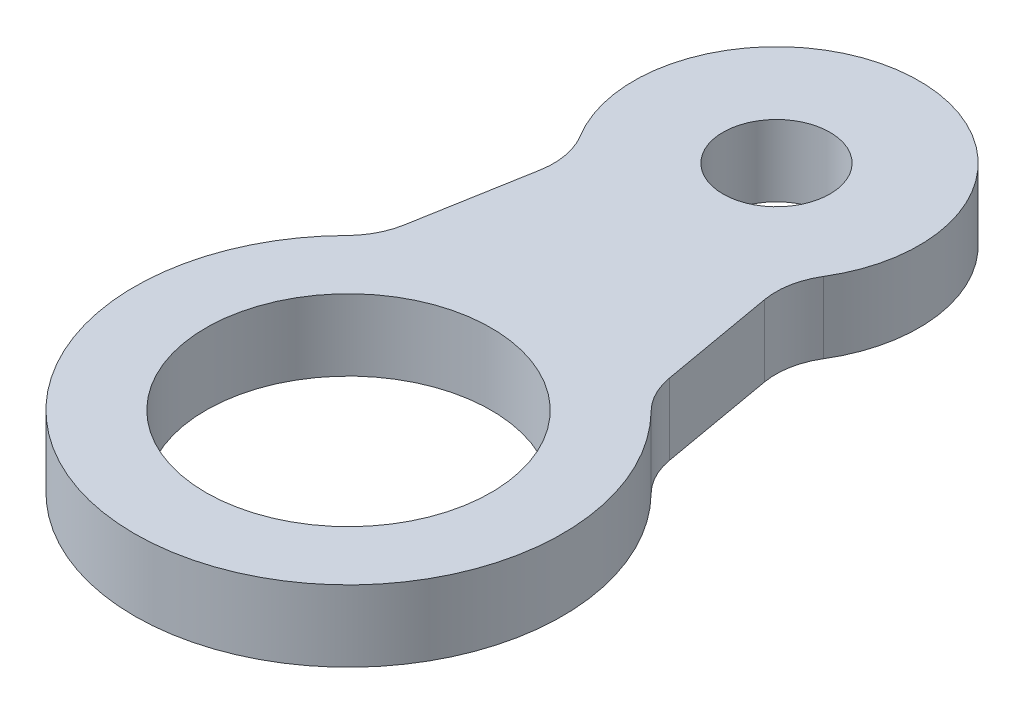
ISO-10303-21;
HEADER;
FILE_DESCRIPTION(('STEP AP214'),'2;1');
FILE_NAME('part.step','',(''),(''),'','','');
FILE_SCHEMA(('AUTOMOTIVE_DESIGN { 1 0 10303 214 1 1 1 1 }'));
ENDSEC;
DATA;
#1=APPLICATION_CONTEXT('core data for automotive mechanical design processes');
#2=APPLICATION_PROTOCOL_DEFINITION('international standard','automotive_design',2000,#1);
#3=PRODUCT_CONTEXT('',#1,'mechanical');
#4=PRODUCT('Part','Part','',(#3));
#5=PRODUCT_RELATED_PRODUCT_CATEGORY('part','',(#4));
#6=PRODUCT_DEFINITION_FORMATION('','',#4);
#7=PRODUCT_DEFINITION_CONTEXT('part definition',#1,'design');
#8=PRODUCT_DEFINITION('design','',#6,#7);
#9=PRODUCT_DEFINITION_SHAPE('','',#8);
#10=(LENGTH_UNIT() NAMED_UNIT(*) SI_UNIT(.MILLI.,.METRE.));
#11=(NAMED_UNIT(*) PLANE_ANGLE_UNIT() SI_UNIT($,.RADIAN.));
#12=(NAMED_UNIT(*) SI_UNIT($,.STERADIAN.) SOLID_ANGLE_UNIT());
#13=UNCERTAINTY_MEASURE_WITH_UNIT(LENGTH_MEASURE(1.E-05),#10,'distance_accuracy_value','');
#14=(GEOMETRIC_REPRESENTATION_CONTEXT(3) GLOBAL_UNCERTAINTY_ASSIGNED_CONTEXT((#13)) GLOBAL_UNIT_ASSIGNED_CONTEXT((#10,
#11,#12)) REPRESENTATION_CONTEXT('',''));
#15=CARTESIAN_POINT('',(0.,0.,0.));
#16=DIRECTION('',(0.,0.,1.));
#17=DIRECTION('',(1.,0.,0.));
#18=AXIS2_PLACEMENT_3D('',#15,#16,#17);
#19=CARTESIAN_POINT('',(0.,12.7,-76.2));
#20=DIRECTION('',(0.,1.,0.));
#21=DIRECTION('',(0.,0.,1.));
#22=AXIS2_PLACEMENT_3D('',#19,#20,#21);
#23=PLANE('',#22);
#24=CARTESIAN_POINT('',(0.,12.7,0.));
#25=DIRECTION('',(0.,1.,0.));
#26=DIRECTION('',(0.,0.,1.));
#27=AXIS2_PLACEMENT_3D('',#24,#25,#26);
#28=CIRCLE('',#27,25.4);
#29=CARTESIAN_POINT('',(0.,12.7,25.4));
#30=VERTEX_POINT('',#29);
#31=EDGE_CURVE('E127',#30,#30,#28,.T.);
#32=ORIENTED_EDGE('',*,*,#31,.F.);
#33=EDGE_LOOP('',(#32));
#34=FACE_BOUND('',#33,.T.);
#35=DIRECTION('',(-0.173648177666932,0.,-0.984807753012208));
#36=VECTOR('',#35,1.);
#37=CARTESIAN_POINT('',(24.3579162597458,12.7,-29.2967901907908));
#38=LINE('',#37,#36);
#39=CARTESIAN_POINT('',(23.6142597591815,12.7,-33.5142757824811));
#40=VERTEX_POINT('',#39);
#41=CARTESIAN_POINT('',(19.9848355558466,12.7,-54.0977632825349));
#42=VERTEX_POINT('',#41);
#43=EDGE_CURVE('E135',#40,#42,#38,.T.);
#44=ORIENTED_EDGE('',*,*,#43,.T.);
#45=CARTESIAN_POINT('',(32.4918940191016,12.7,-56.3030951389049));
#46=DIRECTION('',(0.,1.,0.));
#47=DIRECTION('',(0.,0.,1.));
#48=AXIS2_PLACEMENT_3D('',#45,#46,#47);
#49=CIRCLE('',#48,12.7);
#50=CARTESIAN_POINT('',(21.6612626794011,12.7,-62.93539675927));
#51=VERTEX_POINT('',#50);
#52=EDGE_CURVE('E110',#42,#51,#49,.F.);
#53=ORIENTED_EDGE('',*,*,#52,.T.);
#54=CARTESIAN_POINT('',(0.,12.7,-76.2));
#55=DIRECTION('',(0.,1.,0.));
#56=DIRECTION('',(0.,0.,1.));
#57=AXIS2_PLACEMENT_3D('',#54,#55,#56);
#58=CIRCLE('',#57,25.4);
#59=CARTESIAN_POINT('',(-21.6612626794011,12.7,-62.93539675927));
#60=VERTEX_POINT('',#59);
#61=EDGE_CURVE('E118',#51,#60,#58,.T.);
#62=ORIENTED_EDGE('',*,*,#61,.T.);
#63=CARTESIAN_POINT('',(-32.4918940191016,12.7,-56.3030951389049));
#64=DIRECTION('',(0.,1.,0.));
#65=DIRECTION('',(0.,0.,1.));
#66=AXIS2_PLACEMENT_3D('',#63,#64,#65);
#67=CIRCLE('',#66,12.7);
#68=CARTESIAN_POINT('',(-19.9848355558466,12.7,-54.0977632825349));
#69=VERTEX_POINT('',#68);
#70=EDGE_CURVE('E56',#60,#69,#67,.F.);
#71=ORIENTED_EDGE('',*,*,#70,.T.);
#72=DIRECTION('',(-0.173648177666932,0.,0.984807753012208));
#73=VECTOR('',#72,1.);
#74=CARTESIAN_POINT('',(-24.3579162597458,12.7,-29.2967901907908));
#75=LINE('',#74,#73);
#76=CARTESIAN_POINT('',(-23.6142597591815,12.7,-33.5142757824811));
#77=VERTEX_POINT('',#76);
#78=EDGE_CURVE('E177',#69,#77,#75,.T.);
#79=ORIENTED_EDGE('',*,*,#78,.T.);
#80=CARTESIAN_POINT('',(-36.1213182224366,12.7,-35.7196076388512));
#81=DIRECTION('',(0.,1.,0.));
#82=DIRECTION('',(0.,0.,1.));
#83=AXIS2_PLACEMENT_3D('',#80,#81,#82);
#84=CIRCLE('',#83,12.7);
#85=CARTESIAN_POINT('',(-27.0909886668274,12.7,-26.7897057291384));
#86=VERTEX_POINT('',#85);
#87=EDGE_CURVE('E158',#77,#86,#84,.F.);
#88=ORIENTED_EDGE('',*,*,#87,.T.);
#89=CARTESIAN_POINT('',(0.,12.7,0.));
#90=DIRECTION('',(0.,1.,0.));
#91=DIRECTION('',(0.,0.,1.));
#92=AXIS2_PLACEMENT_3D('',#89,#90,#91);
#93=CIRCLE('',#92,38.1);
#94=CARTESIAN_POINT('',(27.0909886668274,12.7,-26.7897057291384));
#95=VERTEX_POINT('',#94);
#96=EDGE_CURVE('E174',#86,#95,#93,.T.);
#97=ORIENTED_EDGE('',*,*,#96,.T.);
#98=CARTESIAN_POINT('',(36.1213182224366,12.7,-35.7196076388512));
#99=DIRECTION('',(0.,1.,0.));
#100=DIRECTION('',(0.,0.,1.));
#101=AXIS2_PLACEMENT_3D('',#98,#99,#100);
#102=CIRCLE('',#101,12.7);
#103=EDGE_CURVE('E11',#95,#40,#102,.F.);
#104=ORIENTED_EDGE('',*,*,#103,.T.);
#105=EDGE_LOOP('',(#44,#53,#62,#71,#79,#88,#97,#104));
#106=FACE_BOUND('',#105,.T.);
#107=CARTESIAN_POINT('',(0.,12.7,-76.2));
#108=DIRECTION('',(0.,1.,0.));
#109=DIRECTION('',(0.,0.,1.));
#110=AXIS2_PLACEMENT_3D('',#107,#108,#109);
#111=CIRCLE('',#110,9.525);
#112=CARTESIAN_POINT('',(0.,12.7,-66.675));
#113=VERTEX_POINT('',#112);
#114=EDGE_CURVE('E182',#113,#113,#111,.T.);
#115=ORIENTED_EDGE('',*,*,#114,.F.);
#116=EDGE_LOOP('',(#115));
#117=FACE_BOUND('',#116,.T.);
#118=ADVANCED_FACE('F34',(#34,#106,#117),#23,.T.);
#119=CARTESIAN_POINT('',(0.,0.,-76.2));
#120=DIRECTION('',(0.,1.,0.));
#121=DIRECTION('',(0.,0.,1.));
#122=AXIS2_PLACEMENT_3D('',#119,#120,#121);
#123=PLANE('',#122);
#124=CARTESIAN_POINT('',(0.,0.,-76.2));
#125=DIRECTION('',(0.,1.,0.));
#126=DIRECTION('',(0.,0.,1.));
#127=AXIS2_PLACEMENT_3D('',#124,#125,#126);
#128=CIRCLE('',#127,25.4);
#129=CARTESIAN_POINT('',(21.6612626794011,0.,-62.93539675927));
#130=VERTEX_POINT('',#129);
#131=CARTESIAN_POINT('',(-21.6612626794011,0.,-62.93539675927));
#132=VERTEX_POINT('',#131);
#133=EDGE_CURVE('E116',#130,#132,#128,.T.);
#134=ORIENTED_EDGE('',*,*,#133,.F.);
#135=CARTESIAN_POINT('',(32.4918940191016,0.,-56.3030951389049));
#136=DIRECTION('',(0.,1.,0.));
#137=DIRECTION('',(0.,0.,1.));
#138=AXIS2_PLACEMENT_3D('',#135,#136,#137);
#139=CIRCLE('',#138,12.7);
#140=CARTESIAN_POINT('',(19.9848355558466,0.,-54.0977632825349));
#141=VERTEX_POINT('',#140);
#142=EDGE_CURVE('E100',#130,#141,#139,.T.);
#143=ORIENTED_EDGE('',*,*,#142,.T.);
#144=DIRECTION('',(-0.173648177666932,0.,-0.984807753012208));
#145=VECTOR('',#144,1.);
#146=CARTESIAN_POINT('',(24.3579162597458,0.,-29.2967901907908));
#147=LINE('',#146,#145);
#148=CARTESIAN_POINT('',(23.6142597591815,0.,-33.5142757824811));
#149=VERTEX_POINT('',#148);
#150=EDGE_CURVE('E140',#149,#141,#147,.T.);
#151=ORIENTED_EDGE('',*,*,#150,.F.);
#152=CARTESIAN_POINT('',(36.1213182224366,0.,-35.7196076388512));
#153=DIRECTION('',(0.,1.,0.));
#154=DIRECTION('',(0.,0.,1.));
#155=AXIS2_PLACEMENT_3D('',#152,#153,#154);
#156=CIRCLE('',#155,12.7);
#157=CARTESIAN_POINT('',(27.0909886668274,0.,-26.7897057291384));
#158=VERTEX_POINT('',#157);
#159=EDGE_CURVE('E42',#149,#158,#156,.T.);
#160=ORIENTED_EDGE('',*,*,#159,.T.);
#161=CARTESIAN_POINT('',(0.,0.,0.));
#162=DIRECTION('',(0.,1.,0.));
#163=DIRECTION('',(0.,0.,1.));
#164=AXIS2_PLACEMENT_3D('',#161,#162,#163);
#165=CIRCLE('',#164,38.1);
#166=CARTESIAN_POINT('',(-27.0909886668274,0.,-26.7897057291384));
#167=VERTEX_POINT('',#166);
#168=EDGE_CURVE('E129',#167,#158,#165,.T.);
#169=ORIENTED_EDGE('',*,*,#168,.F.);
#170=CARTESIAN_POINT('',(-36.1213182224366,0.,-35.7196076388512));
#171=DIRECTION('',(0.,1.,0.));
#172=DIRECTION('',(0.,0.,1.));
#173=AXIS2_PLACEMENT_3D('',#170,#171,#172);
#174=CIRCLE('',#173,12.7);
#175=CARTESIAN_POINT('',(-23.6142597591815,0.,-33.5142757824811));
#176=VERTEX_POINT('',#175);
#177=EDGE_CURVE('E156',#167,#176,#174,.T.);
#178=ORIENTED_EDGE('',*,*,#177,.T.);
#179=DIRECTION('',(-0.173648177666932,0.,0.984807753012208));
#180=VECTOR('',#179,1.);
#181=CARTESIAN_POINT('',(-24.3579162597458,0.,-29.2967901907908));
#182=LINE('',#181,#180);
#183=CARTESIAN_POINT('',(-19.9848355558466,0.,-54.0977632825349));
#184=VERTEX_POINT('',#183);
#185=EDGE_CURVE('E126',#184,#176,#182,.T.);
#186=ORIENTED_EDGE('',*,*,#185,.F.);
#187=CARTESIAN_POINT('',(-32.4918940191016,0.,-56.3030951389049));
#188=DIRECTION('',(0.,1.,0.));
#189=DIRECTION('',(0.,0.,1.));
#190=AXIS2_PLACEMENT_3D('',#187,#188,#189);
#191=CIRCLE('',#190,12.7);
#192=EDGE_CURVE('E125',#184,#132,#191,.T.);
#193=ORIENTED_EDGE('',*,*,#192,.T.);
#194=EDGE_LOOP('',(#134,#143,#151,#160,#169,#178,#186,#193));
#195=FACE_BOUND('',#194,.T.);
#196=CARTESIAN_POINT('',(0.,0.,0.));
#197=DIRECTION('',(0.,1.,0.));
#198=DIRECTION('',(0.,0.,1.));
#199=AXIS2_PLACEMENT_3D('',#196,#197,#198);
#200=CIRCLE('',#199,25.4);
#201=CARTESIAN_POINT('',(0.,0.,25.4));
#202=VERTEX_POINT('',#201);
#203=EDGE_CURVE('E132',#202,#202,#200,.T.);
#204=ORIENTED_EDGE('',*,*,#203,.T.);
#205=EDGE_LOOP('',(#204));
#206=FACE_BOUND('',#205,.T.);
#207=CARTESIAN_POINT('',(0.,0.,-76.2));
#208=DIRECTION('',(0.,1.,0.));
#209=DIRECTION('',(0.,0.,1.));
#210=AXIS2_PLACEMENT_3D('',#207,#208,#209);
#211=CIRCLE('',#210,9.525);
#212=CARTESIAN_POINT('',(0.,0.,-66.675));
#213=VERTEX_POINT('',#212);
#214=EDGE_CURVE('E184',#213,#213,#211,.T.);
#215=ORIENTED_EDGE('',*,*,#214,.T.);
#216=EDGE_LOOP('',(#215));
#217=FACE_BOUND('',#216,.T.);
#218=ADVANCED_FACE('F122',(#195,#206,#217),#123,.F.);
#219=CARTESIAN_POINT('',(0.,12.7,-76.2));
#220=DIRECTION('',(0.,-1.,0.));
#221=DIRECTION('',(0.,0.,-1.));
#222=AXIS2_PLACEMENT_3D('',#219,#220,#221);
#223=CYLINDRICAL_SURFACE('',#222,25.4);
#224=ORIENTED_EDGE('',*,*,#61,.F.);
#225=DIRECTION('',(0.,-1.,0.));
#226=VECTOR('',#225,1.);
#227=CARTESIAN_POINT('',(21.6612626794011,12.7,-62.93539675927));
#228=LINE('',#227,#226);
#229=EDGE_CURVE('E104',#51,#130,#228,.T.);
#230=ORIENTED_EDGE('',*,*,#229,.T.);
#231=ORIENTED_EDGE('',*,*,#133,.T.);
#232=DIRECTION('',(0.,-1.,0.));
#233=VECTOR('',#232,1.);
#234=CARTESIAN_POINT('',(-21.6612626794011,12.7,-62.93539675927));
#235=LINE('',#234,#233);
#236=EDGE_CURVE('E120',#132,#60,#235,.F.);
#237=ORIENTED_EDGE('',*,*,#236,.T.);
#238=EDGE_LOOP('',(#224,#230,#231,#237));
#239=FACE_BOUND('',#238,.T.);
#240=ADVANCED_FACE('F115',(#239),#223,.T.);
#241=CARTESIAN_POINT('',(-24.3579162597458,12.7,-29.2967901907908));
#242=DIRECTION('',(0.984807753012208,0.,0.173648177666932));
#243=DIRECTION('',(0.173648177666932,0.,-0.984807753012208));
#244=AXIS2_PLACEMENT_3D('',#241,#242,#243);
#245=PLANE('',#244);
#246=ORIENTED_EDGE('',*,*,#185,.T.);
#247=DIRECTION('',(0.,1.,0.));
#248=VECTOR('',#247,1.);
#249=CARTESIAN_POINT('',(-23.6142597591815,12.7,-33.5142757824811));
#250=LINE('',#249,#248);
#251=EDGE_CURVE('E49',#176,#77,#250,.T.);
#252=ORIENTED_EDGE('',*,*,#251,.T.);
#253=ORIENTED_EDGE('',*,*,#78,.F.);
#254=DIRECTION('',(0.,1.,0.));
#255=VECTOR('',#254,1.);
#256=CARTESIAN_POINT('',(-19.9848355558466,0.,-54.0977632825349));
#257=LINE('',#256,#255);
#258=EDGE_CURVE('E151',#69,#184,#257,.F.);
#259=ORIENTED_EDGE('',*,*,#258,.T.);
#260=EDGE_LOOP('',(#246,#252,#253,#259));
#261=FACE_BOUND('',#260,.T.);
#262=ADVANCED_FACE('F208',(#261),#245,.F.);
#263=CARTESIAN_POINT('',(0.,12.7,0.));
#264=DIRECTION('',(0.,-1.,0.));
#265=DIRECTION('',(0.,0.,-1.));
#266=AXIS2_PLACEMENT_3D('',#263,#264,#265);
#267=CYLINDRICAL_SURFACE('',#266,38.1);
#268=ORIENTED_EDGE('',*,*,#96,.F.);
#269=DIRECTION('',(0.,-1.,0.));
#270=VECTOR('',#269,1.);
#271=CARTESIAN_POINT('',(-27.0909886668274,12.7,-26.7897057291384));
#272=LINE('',#271,#270);
#273=EDGE_CURVE('E148',#86,#167,#272,.T.);
#274=ORIENTED_EDGE('',*,*,#273,.T.);
#275=ORIENTED_EDGE('',*,*,#168,.T.);
#276=DIRECTION('',(0.,-1.,0.));
#277=VECTOR('',#276,1.);
#278=CARTESIAN_POINT('',(27.0909886668274,12.7,-26.7897057291384));
#279=LINE('',#278,#277);
#280=EDGE_CURVE('E146',#158,#95,#279,.F.);
#281=ORIENTED_EDGE('',*,*,#280,.T.);
#282=EDGE_LOOP('',(#268,#274,#275,#281));
#283=FACE_BOUND('',#282,.T.);
#284=ADVANCED_FACE('F167',(#283),#267,.T.);
#285=CARTESIAN_POINT('',(24.3579162597458,12.7,-29.2967901907908));
#286=DIRECTION('',(-0.984807753012208,0.,0.173648177666932));
#287=DIRECTION('',(0.173648177666932,0.,0.984807753012208));
#288=AXIS2_PLACEMENT_3D('',#285,#286,#287);
#289=PLANE('',#288);
#290=ORIENTED_EDGE('',*,*,#150,.T.);
#291=DIRECTION('',(0.,1.,0.));
#292=VECTOR('',#291,1.);
#293=CARTESIAN_POINT('',(19.9848355558466,12.7,-54.0977632825349));
#294=LINE('',#293,#292);
#295=EDGE_CURVE('E105',#141,#42,#294,.T.);
#296=ORIENTED_EDGE('',*,*,#295,.T.);
#297=ORIENTED_EDGE('',*,*,#43,.F.);
#298=DIRECTION('',(0.,1.,0.));
#299=VECTOR('',#298,1.);
#300=CARTESIAN_POINT('',(23.6142597591815,0.,-33.5142757824811));
#301=LINE('',#300,#299);
#302=EDGE_CURVE('E119',#40,#149,#301,.F.);
#303=ORIENTED_EDGE('',*,*,#302,.T.);
#304=EDGE_LOOP('',(#290,#296,#297,#303));
#305=FACE_BOUND('',#304,.T.);
#306=ADVANCED_FACE('F176',(#305),#289,.F.);
#307=CARTESIAN_POINT('',(0.,12.7,0.));
#308=DIRECTION('',(0.,-1.,0.));
#309=DIRECTION('',(0.,0.,-1.));
#310=AXIS2_PLACEMENT_3D('',#307,#308,#309);
#311=CYLINDRICAL_SURFACE('',#310,25.4);
#312=ORIENTED_EDGE('',*,*,#31,.T.);
#313=EDGE_LOOP('',(#312));
#314=FACE_BOUND('',#313,.T.);
#315=ORIENTED_EDGE('',*,*,#203,.F.);
#316=EDGE_LOOP('',(#315));
#317=FACE_BOUND('',#316,.T.);
#318=ADVANCED_FACE('F201',(#314,#317),#311,.F.);
#319=CARTESIAN_POINT('',(0.,12.7,-76.2));
#320=DIRECTION('',(0.,-1.,0.));
#321=DIRECTION('',(0.,0.,-1.));
#322=AXIS2_PLACEMENT_3D('',#319,#320,#321);
#323=CYLINDRICAL_SURFACE('',#322,9.525);
#324=ORIENTED_EDGE('',*,*,#114,.T.);
#325=EDGE_LOOP('',(#324));
#326=FACE_BOUND('',#325,.T.);
#327=ORIENTED_EDGE('',*,*,#214,.F.);
#328=EDGE_LOOP('',(#327));
#329=FACE_BOUND('',#328,.T.);
#330=ADVANCED_FACE('F190',(#326,#329),#323,.F.);
#331=CARTESIAN_POINT('',(32.4918940191016,12.7,-56.3030951389049));
#332=DIRECTION('',(0.,-1.,0.));
#333=DIRECTION('',(0.,0.,-1.));
#334=AXIS2_PLACEMENT_3D('',#331,#332,#333);
#335=CYLINDRICAL_SURFACE('',#334,12.7);
#336=ORIENTED_EDGE('',*,*,#52,.F.);
#337=ORIENTED_EDGE('',*,*,#295,.F.);
#338=ORIENTED_EDGE('',*,*,#142,.F.);
#339=ORIENTED_EDGE('',*,*,#229,.F.);
#340=EDGE_LOOP('',(#336,#337,#338,#339));
#341=FACE_BOUND('',#340,.T.);
#342=ADVANCED_FACE('F103',(#341),#335,.F.);
#343=CARTESIAN_POINT('',(-36.1213182224366,12.7,-35.7196076388512));
#344=DIRECTION('',(0.,-1.,0.));
#345=DIRECTION('',(0.,0.,-1.));
#346=AXIS2_PLACEMENT_3D('',#343,#344,#345);
#347=CYLINDRICAL_SURFACE('',#346,12.7);
#348=ORIENTED_EDGE('',*,*,#87,.F.);
#349=ORIENTED_EDGE('',*,*,#251,.F.);
#350=ORIENTED_EDGE('',*,*,#177,.F.);
#351=ORIENTED_EDGE('',*,*,#273,.F.);
#352=EDGE_LOOP('',(#348,#349,#350,#351));
#353=FACE_BOUND('',#352,.T.);
#354=ADVANCED_FACE('F215',(#353),#347,.F.);
#355=CARTESIAN_POINT('',(-32.4918940191016,12.7,-56.3030951389049));
#356=DIRECTION('',(0.,-1.,0.));
#357=DIRECTION('',(0.,0.,-1.));
#358=AXIS2_PLACEMENT_3D('',#355,#356,#357);
#359=CYLINDRICAL_SURFACE('',#358,12.7);
#360=ORIENTED_EDGE('',*,*,#70,.F.);
#361=ORIENTED_EDGE('',*,*,#236,.F.);
#362=ORIENTED_EDGE('',*,*,#192,.F.);
#363=ORIENTED_EDGE('',*,*,#258,.F.);
#364=EDGE_LOOP('',(#360,#361,#362,#363));
#365=FACE_BOUND('',#364,.T.);
#366=ADVANCED_FACE('F217',(#365),#359,.F.);
#367=CARTESIAN_POINT('',(36.1213182224366,12.7,-35.7196076388512));
#368=DIRECTION('',(0.,-1.,0.));
#369=DIRECTION('',(0.,0.,-1.));
#370=AXIS2_PLACEMENT_3D('',#367,#368,#369);
#371=CYLINDRICAL_SURFACE('',#370,12.7);
#372=ORIENTED_EDGE('',*,*,#103,.F.);
#373=ORIENTED_EDGE('',*,*,#280,.F.);
#374=ORIENTED_EDGE('',*,*,#159,.F.);
#375=ORIENTED_EDGE('',*,*,#302,.F.);
#376=EDGE_LOOP('',(#372,#373,#374,#375));
#377=FACE_BOUND('',#376,.T.);
#378=ADVANCED_FACE('F36',(#377),#371,.F.);
#379=CLOSED_SHELL('',(#118,#218,#240,#262,#284,#306,#318,#330,#342,#354,#366,#378));
#380=MANIFOLD_SOLID_BREP('B2',#379);
#381=ADVANCED_BREP_SHAPE_REPRESENTATION('',(#18,#380),#14);
#382=SHAPE_DEFINITION_REPRESENTATION(#9,#381);
ENDSEC;
END-ISO-10303-21;
